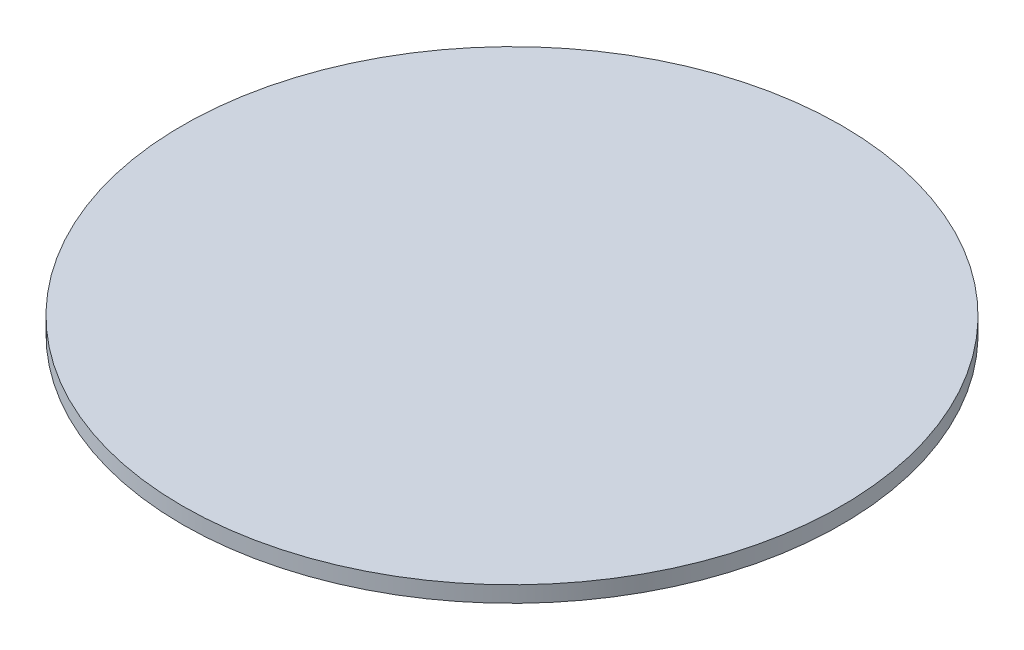
ISO-10303-21;
HEADER;
FILE_DESCRIPTION(('STEP AP214'),'2;1');
FILE_NAME('part.step','',(''),(''),'','','');
FILE_SCHEMA(('AUTOMOTIVE_DESIGN { 1 0 10303 214 1 1 1 1 }'));
ENDSEC;
DATA;
#1=APPLICATION_CONTEXT('core data for automotive mechanical design processes');
#2=APPLICATION_PROTOCOL_DEFINITION('international standard','automotive_design',2000,#1);
#3=PRODUCT_CONTEXT('',#1,'mechanical');
#4=PRODUCT('Part','Part','',(#3));
#5=PRODUCT_RELATED_PRODUCT_CATEGORY('part','',(#4));
#6=PRODUCT_DEFINITION_FORMATION('','',#4);
#7=PRODUCT_DEFINITION_CONTEXT('part definition',#1,'design');
#8=PRODUCT_DEFINITION('design','',#6,#7);
#9=PRODUCT_DEFINITION_SHAPE('','',#8);
#10=(LENGTH_UNIT() NAMED_UNIT(*) SI_UNIT(.MILLI.,.METRE.));
#11=(NAMED_UNIT(*) PLANE_ANGLE_UNIT() SI_UNIT($,.RADIAN.));
#12=(NAMED_UNIT(*) SI_UNIT($,.STERADIAN.) SOLID_ANGLE_UNIT());
#13=UNCERTAINTY_MEASURE_WITH_UNIT(LENGTH_MEASURE(1.E-05),#10,'distance_accuracy_value','');
#14=(GEOMETRIC_REPRESENTATION_CONTEXT(3) GLOBAL_UNCERTAINTY_ASSIGNED_CONTEXT((#13)) GLOBAL_UNIT_ASSIGNED_CONTEXT((#10,
#11,#12)) REPRESENTATION_CONTEXT('',''));
#15=CARTESIAN_POINT('',(0.,0.,0.));
#16=DIRECTION('',(0.,0.,1.));
#17=DIRECTION('',(1.,0.,0.));
#18=AXIS2_PLACEMENT_3D('',#15,#16,#17);
#19=CARTESIAN_POINT('',(0.,5.,0.));
#20=DIRECTION('',(0.,-1.,0.));
#21=DIRECTION('',(0.,0.,-1.));
#22=AXIS2_PLACEMENT_3D('',#19,#20,#21);
#23=CYLINDRICAL_SURFACE('',#22,102.5);
#24=CARTESIAN_POINT('',(0.,5.,0.));
#25=DIRECTION('',(0.,1.,0.));
#26=DIRECTION('',(0.,0.,1.));
#27=AXIS2_PLACEMENT_3D('',#24,#25,#26);
#28=CIRCLE('',#27,102.5);
#29=CARTESIAN_POINT('',(0.,5.,102.5));
#30=VERTEX_POINT('',#29);
#31=EDGE_CURVE('E10',#30,#30,#28,.T.);
#32=ORIENTED_EDGE('',*,*,#31,.F.);
#33=EDGE_LOOP('',(#32));
#34=FACE_BOUND('',#33,.T.);
#35=CARTESIAN_POINT('',(0.,0.,0.));
#36=DIRECTION('',(0.,1.,0.));
#37=DIRECTION('',(0.,0.,1.));
#38=AXIS2_PLACEMENT_3D('',#35,#36,#37);
#39=CIRCLE('',#38,102.5);
#40=CARTESIAN_POINT('',(0.,0.,102.5));
#41=VERTEX_POINT('',#40);
#42=EDGE_CURVE('E40',#41,#41,#39,.T.);
#43=ORIENTED_EDGE('',*,*,#42,.T.);
#44=EDGE_LOOP('',(#43));
#45=FACE_BOUND('',#44,.T.);
#46=ADVANCED_FACE('F37',(#34,#45),#23,.T.);
#47=CARTESIAN_POINT('',(0.,5.,0.));
#48=DIRECTION('',(0.,1.,0.));
#49=DIRECTION('',(0.,0.,1.));
#50=AXIS2_PLACEMENT_3D('',#47,#48,#49);
#51=PLANE('',#50);
#52=ORIENTED_EDGE('',*,*,#31,.T.);
#53=EDGE_LOOP('',(#52));
#54=FACE_BOUND('',#53,.T.);
#55=ADVANCED_FACE('F52',(#54),#51,.T.);
#56=CARTESIAN_POINT('',(0.,0.,0.));
#57=DIRECTION('',(0.,1.,0.));
#58=DIRECTION('',(0.,0.,1.));
#59=AXIS2_PLACEMENT_3D('',#56,#57,#58);
#60=PLANE('',#59);
#61=ORIENTED_EDGE('',*,*,#42,.F.);
#62=EDGE_LOOP('',(#61));
#63=FACE_BOUND('',#62,.T.);
#64=ADVANCED_FACE('F50',(#63),#60,.F.);
#65=CLOSED_SHELL('',(#46,#55,#64));
#66=MANIFOLD_SOLID_BREP('B2',#65);
#67=ADVANCED_BREP_SHAPE_REPRESENTATION('',(#18,#66),#14);
#68=SHAPE_DEFINITION_REPRESENTATION(#9,#67);
ENDSEC;
END-ISO-10303-21;
